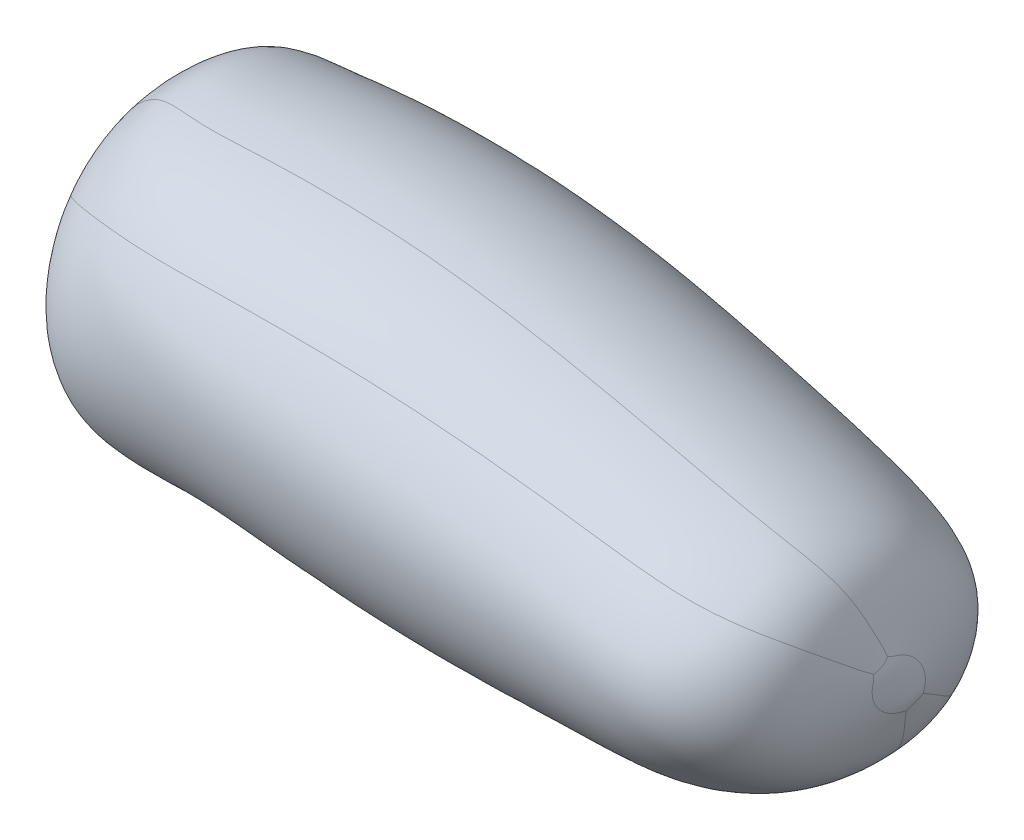
ISO-10303-21;
HEADER;
FILE_DESCRIPTION(('STEP AP214'),'2;1');
FILE_NAME('part.step','',(''),(''),'','','');
FILE_SCHEMA(('AUTOMOTIVE_DESIGN { 1 0 10303 214 1 1 1 1 }'));
ENDSEC;
DATA;
#1=APPLICATION_CONTEXT('core data for automotive mechanical design processes');
#2=APPLICATION_PROTOCOL_DEFINITION('international standard','automotive_design',2000,#1);
#3=PRODUCT_CONTEXT('',#1,'mechanical');
#4=PRODUCT('Part','Part','',(#3));
#5=PRODUCT_RELATED_PRODUCT_CATEGORY('part','',(#4));
#6=PRODUCT_DEFINITION_FORMATION('','',#4);
#7=PRODUCT_DEFINITION_CONTEXT('part definition',#1,'design');
#8=PRODUCT_DEFINITION('design','',#6,#7);
#9=PRODUCT_DEFINITION_SHAPE('','',#8);
#10=(LENGTH_UNIT() NAMED_UNIT(*) SI_UNIT(.MILLI.,.METRE.));
#11=(NAMED_UNIT(*) PLANE_ANGLE_UNIT() SI_UNIT($,.RADIAN.));
#12=(NAMED_UNIT(*) SI_UNIT($,.STERADIAN.) SOLID_ANGLE_UNIT());
#13=UNCERTAINTY_MEASURE_WITH_UNIT(LENGTH_MEASURE(1.E-05),#10,'distance_accuracy_value','');
#14=(GEOMETRIC_REPRESENTATION_CONTEXT(3) GLOBAL_UNCERTAINTY_ASSIGNED_CONTEXT((#13)) GLOBAL_UNIT_ASSIGNED_CONTEXT((#10,
#11,#12)) REPRESENTATION_CONTEXT('',''));
#15=CARTESIAN_POINT('',(0.,0.,0.));
#16=DIRECTION('',(0.,0.,1.));
#17=DIRECTION('',(1.,0.,0.));
#18=AXIS2_PLACEMENT_3D('',#15,#16,#17);
#19=CARTESIAN_POINT('',(727.895790934935,1292.65888960859,-70.9432477584007));
#20=CARTESIAN_POINT('',(727.857525232089,1292.3817548596,-70.8732304235021));
#21=CARTESIAN_POINT('',(727.905741223609,1291.50471669185,-70.6595783417249));
#22=CARTESIAN_POINT('',(727.834004185065,1289.98045953672,-71.1788150169642));
#23=CARTESIAN_POINT('',(727.667987957298,1288.81371187425,-72.3345468414918));
#24=CARTESIAN_POINT('',(727.547715787735,1288.54565294954,-73.2427119621077));
#25=CARTESIAN_POINT('',(727.564858137279,1288.44412809889,-73.5326735927703));
#26=CARTESIAN_POINT('',(727.796349837973,1292.81874561611,-71.2954127522957));
#27=CARTESIAN_POINT('',(727.620377335375,1292.42433212561,-71.5075430763932));
#28=CARTESIAN_POINT('',(727.626562590129,1291.78694473596,-71.606695018846));
#29=CARTESIAN_POINT('',(727.555006263865,1290.48258073661,-72.2163432330707));
#30=CARTESIAN_POINT('',(727.434234791081,1289.3659000228,-73.0510214296392));
#31=CARTESIAN_POINT('',(727.359704535739,1289.00602350146,-73.5740145432364));
#32=CARTESIAN_POINT('',(727.479423686043,1288.62355094953,-73.8433056986715));
#33=CARTESIAN_POINT('',(727.712018241407,1293.16063550165,-71.9460923933082));
#34=CARTESIAN_POINT('',(727.528941566347,1292.79247485655,-72.2277657538675));
#35=CARTESIAN_POINT('',(727.473334138315,1292.39698081756,-72.8451198390166));
#36=CARTESIAN_POINT('',(727.388989533651,1291.16502504722,-73.7287733568525));
#37=CARTESIAN_POINT('',(727.31341113939,1289.8925245156,-74.2378963339463));
#38=CARTESIAN_POINT('',(727.29186990564,1289.31105049952,-74.2633460385086));
#39=CARTESIAN_POINT('',(727.418717790246,1288.89802278056,-74.4652309009601));
#40=CARTESIAN_POINT('',(727.722384490781,1293.35607293605,-72.2879009447821));
#41=CARTESIAN_POINT('',(727.636029277934,1293.26971133072,-72.5996419007878));
#42=CARTESIAN_POINT('',(727.533475061081,1292.97447892925,-73.6342813537652));
#43=CARTESIAN_POINT('',(727.43043574521,1291.61242160487,-74.8125603602637));
#44=CARTESIAN_POINT('',(727.372399920789,1290.07070527965,-75.1784516200874));
#45=CARTESIAN_POINT('',(727.381829240966,1289.2733101656,-74.8920523945349));
#46=CARTESIAN_POINT('',(727.436408052267,1289.01053846427,-74.8170735175011));
#47=(BOUNDED_SURFACE() B_SPLINE_SURFACE(3,3,((#19,#20,#21,#22,#23,#24,#25),(#26,#27,#28,#29,#30,
#31,#32),(#33,#34,#35,#36,#37,#38,#39),(#40,#41,#42,#43,#44,#45,#46)),.UNSPECIFIED.,.F.,.F.,
.F.) B_SPLINE_SURFACE_WITH_KNOTS((4,4),(4,1,1,1,4),(0.,1.),(0.,1.,2.,3.,4.),
.UNSPECIFIED.) GEOMETRIC_REPRESENTATION_ITEM() RATIONAL_B_SPLINE_SURFACE(((0.75,1.,1.,1.,1.,1.,
0.75),(1.,1.,1.,1.,1.,1.,1.),(1.,1.,1.,1.,1.,1.,1.),(0.75,1.,1.,1.,1.,1.,0.75))) REPRESENTATION_ITEM('') SURFACE());
#48=CARTESIAN_POINT('',(727.722384490781,1293.35607293605,-72.2879009447821));
#49=CARTESIAN_POINT('',(727.712018241407,1293.16063550165,-71.9460923933082));
#50=CARTESIAN_POINT('',(727.796349837973,1292.81874561611,-71.2954127522957));
#51=CARTESIAN_POINT('',(727.895790934935,1292.65888960859,-70.9432477584007));
#52=(BOUNDED_CURVE() B_SPLINE_CURVE(3,(#48,#49,#50,#51),.UNSPECIFIED.,.F.,
.F.) B_SPLINE_CURVE_WITH_KNOTS((4,4),(0.,1.),
.UNSPECIFIED.) CURVE() GEOMETRIC_REPRESENTATION_ITEM() RATIONAL_B_SPLINE_CURVE((0.75,1.,1.,0.75)) REPRESENTATION_ITEM(''));
#53=CARTESIAN_POINT('',(727.722384490781,1293.35607293605,-72.2879009447821));
#54=VERTEX_POINT('',#53);
#55=CARTESIAN_POINT('',(727.895790934935,1292.65888960859,-70.9432477584007));
#56=VERTEX_POINT('',#55);
#57=EDGE_CURVE('E76',#54,#56,#52,.T.);
#58=CARTESIAN_POINT('',(727.722384490781,1293.35607293605,-72.2879009447821));
#59=CARTESIAN_POINT('',(727.636029277934,1293.26971133072,-72.5996419007878));
#60=CARTESIAN_POINT('',(727.533475061081,1292.97447892925,-73.6342813537652));
#61=CARTESIAN_POINT('',(727.43043574521,1291.61242160487,-74.8125603602637));
#62=CARTESIAN_POINT('',(727.372399920789,1290.07070527965,-75.1784516200874));
#63=CARTESIAN_POINT('',(727.381829240966,1289.2733101656,-74.8920523945349));
#64=CARTESIAN_POINT('',(727.436408052267,1289.01053846427,-74.8170735175011));
#65=(BOUNDED_CURVE() B_SPLINE_CURVE(3,(#58,#59,#60,#61,#62,#63,#64),.UNSPECIFIED.,.F.,
.F.) B_SPLINE_CURVE_WITH_KNOTS((4,1,1,1,4),(0.,1.,2.,3.,4.),
.UNSPECIFIED.) CURVE() GEOMETRIC_REPRESENTATION_ITEM() RATIONAL_B_SPLINE_CURVE((0.75,1.,1.,1.,
1.,1.,0.75)) REPRESENTATION_ITEM(''));
#66=CARTESIAN_POINT('',(727.436408052267,1289.01053846427,-74.817073517501));
#67=VERTEX_POINT('',#66);
#68=EDGE_CURVE('E79',#67,#54,#65,.F.);
#69=CARTESIAN_POINT('',(727.564858137279,1288.44412809889,-73.5326735927703));
#70=CARTESIAN_POINT('',(727.479423686043,1288.62355094953,-73.8433056986715));
#71=CARTESIAN_POINT('',(727.418717790246,1288.89802278056,-74.4652309009601));
#72=CARTESIAN_POINT('',(727.436408052267,1289.01053846427,-74.8170735175011));
#73=(BOUNDED_CURVE() B_SPLINE_CURVE(3,(#69,#70,#71,#72),.UNSPECIFIED.,.F.,
.F.) B_SPLINE_CURVE_WITH_KNOTS((4,4),(0.,1.),
.UNSPECIFIED.) CURVE() GEOMETRIC_REPRESENTATION_ITEM() RATIONAL_B_SPLINE_CURVE((0.75,1.,1.,0.75)) REPRESENTATION_ITEM(''));
#74=CARTESIAN_POINT('',(727.564858137278,1288.44412809889,-73.5326735927703));
#75=VERTEX_POINT('',#74);
#76=EDGE_CURVE('E107',#67,#75,#73,.F.);
#77=CARTESIAN_POINT('',(727.564858137279,1288.44412809889,-73.5326735927703));
#78=CARTESIAN_POINT('',(727.547715787735,1288.54565294954,-73.2427119621077));
#79=CARTESIAN_POINT('',(727.667987957298,1288.81371187425,-72.3345468414918));
#80=CARTESIAN_POINT('',(727.834004185065,1289.98045953672,-71.1788150169642));
#81=CARTESIAN_POINT('',(727.905741223609,1291.50471669185,-70.6595783417249));
#82=CARTESIAN_POINT('',(727.857525232089,1292.3817548596,-70.8732304235021));
#83=CARTESIAN_POINT('',(727.895790934935,1292.65888960859,-70.9432477584007));
#84=(BOUNDED_CURVE() B_SPLINE_CURVE(3,(#77,#78,#79,#80,#81,#82,#83),.UNSPECIFIED.,.F.,
.F.) B_SPLINE_CURVE_WITH_KNOTS((4,1,1,1,4),(0.,1.,2.,3.,4.),
.UNSPECIFIED.) CURVE() GEOMETRIC_REPRESENTATION_ITEM() RATIONAL_B_SPLINE_CURVE((0.75,1.,1.,1.,
1.,1.,0.75)) REPRESENTATION_ITEM(''));
#85=EDGE_CURVE('E82',#56,#75,#84,.F.);
#86=ORIENTED_EDGE('',*,*,#57,.F.);
#87=ORIENTED_EDGE('',*,*,#68,.F.);
#88=ORIENTED_EDGE('',*,*,#76,.T.);
#89=ORIENTED_EDGE('',*,*,#85,.F.);
#90=EDGE_LOOP('',(#86,#87,#88,#89));
#91=FACE_BOUND('',#90,.T.);
#92=ADVANCED_FACE('F33',(#91),#47,.T.);
#93=CARTESIAN_POINT('',(755.014879637663,1287.97846725011,-75.1172581475418));
#94=CARTESIAN_POINT('',(755.057385606633,1287.95703309226,-74.9120606616865));
#95=CARTESIAN_POINT('',(755.063471681654,1287.85817061027,-74.6337769279165));
#96=CARTESIAN_POINT('',(755.033113317336,1287.7588492855,-74.4767499142738));
#97=CARTESIAN_POINT('',(755.061221092996,1288.13123648074,-75.1078935626558));
#98=CARTESIAN_POINT('',(755.192574486305,1288.24113739568,-74.688134006092));
#99=CARTESIAN_POINT('',(755.200897884253,1288.14346406595,-74.4087307578159));
#100=CARTESIAN_POINT('',(755.086647236468,1287.85183535096,-74.2857133224239));
#101=CARTESIAN_POINT('',(755.086103314203,1288.50056778811,-75.1851432902321));
#102=CARTESIAN_POINT('',(755.219299479098,1288.48308972501,-74.61363029583));
#103=CARTESIAN_POINT('',(755.24010128673,1288.31729268108,-74.1161728674537));
#104=CARTESIAN_POINT('',(755.14875129527,1288.02613077418,-73.720471385505));
#105=CARTESIAN_POINT('',(755.126737726381,1289.18506341885,-74.9311463681352));
#106=CARTESIAN_POINT('',(755.264762914278,1289.00143163266,-74.3349108032536));
#107=CARTESIAN_POINT('',(755.309451572832,1288.82396205785,-73.6967130291101));
#108=CARTESIAN_POINT('',(755.25896790665,1288.67689385671,-73.0509195561584));
#109=CARTESIAN_POINT('',(755.1652717274,1289.78648851624,-74.2983409529255));
#110=CARTESIAN_POINT('',(755.290350392555,1289.46841397328,-73.9563991579886));
#111=CARTESIAN_POINT('',(755.3293850499,1289.30327487166,-73.4827947692707));
#112=CARTESIAN_POINT('',(755.279549766059,1289.30984237754,-72.9033761664824));
#113=CARTESIAN_POINT('',(755.195576323844,1289.90754229801,-73.8102659265982));
#114=CARTESIAN_POINT('',(755.3062672046,1289.59843618107,-73.7184494558356));
#115=CARTESIAN_POINT('',(755.33391439379,1289.49479854137,-73.4573663666932));
#116=CARTESIAN_POINT('',(755.276735848495,1289.60859272306,-73.0416332430992));
#117=CARTESIAN_POINT('',(755.17804443598,1289.99066793212,-73.6338257112497));
#118=CARTESIAN_POINT('',(755.224623932417,1289.87767769071,-73.4996973681886));
#119=CARTESIAN_POINT('',(755.256322040381,1289.76797292463,-73.2431373528388));
#120=CARTESIAN_POINT('',(755.24406712799,1289.75277758467,-73.0373916083979));
#121=(BOUNDED_SURFACE() B_SPLINE_SURFACE(3,3,((#93,#94,#95,#96),(#97,#98,#99,#100),(#101,#102,
#103,#104),(#105,#106,#107,#108),(#109,#110,#111,#112),(#113,#114,#115,#116),(#117,#118,#119,
#120)),.UNSPECIFIED.,.F.,.F.,.F.) B_SPLINE_SURFACE_WITH_KNOTS((4,1,1,1,4),(4,4),(0.,1.,2.,3.,
4.),(0.,1.),.UNSPECIFIED.) GEOMETRIC_REPRESENTATION_ITEM() RATIONAL_B_SPLINE_SURFACE(((0.75,1.,
1.,0.75),(1.,1.,1.,1.),(1.,1.,1.,1.),(1.,1.,1.,1.),(1.,1.,1.,1.),(1.,1.,1.,1.),(0.75,1.,1.,0.75))) REPRESENTATION_ITEM('') SURFACE());
#122=CARTESIAN_POINT('',(755.17804443598,1289.99066793212,-73.6338257112497));
#123=CARTESIAN_POINT('',(755.195576323844,1289.90754229801,-73.8102659265982));
#124=CARTESIAN_POINT('',(755.1652717274,1289.78648851624,-74.2983409529255));
#125=CARTESIAN_POINT('',(755.126737726381,1289.18506341885,-74.9311463681352));
#126=CARTESIAN_POINT('',(755.086103314203,1288.50056778811,-75.1851432902321));
#127=CARTESIAN_POINT('',(755.061221092996,1288.13123648074,-75.1078935626558));
#128=CARTESIAN_POINT('',(755.014879637663,1287.97846725011,-75.1172581475418));
#129=(BOUNDED_CURVE() B_SPLINE_CURVE(3,(#122,#123,#124,#125,#126,#127,#128),.UNSPECIFIED.,.F.,
.F.) B_SPLINE_CURVE_WITH_KNOTS((4,1,1,1,4),(0.,1.,2.,3.,4.),
.UNSPECIFIED.) CURVE() GEOMETRIC_REPRESENTATION_ITEM() RATIONAL_B_SPLINE_CURVE((0.75,1.,1.,1.,
1.,1.,0.75)) REPRESENTATION_ITEM(''));
#130=CARTESIAN_POINT('',(755.17804443598,1289.99066793212,-73.6338257112496));
#131=VERTEX_POINT('',#130);
#132=CARTESIAN_POINT('',(755.014879637663,1287.97846725011,-75.1172581475417));
#133=VERTEX_POINT('',#132);
#134=EDGE_CURVE('E93',#131,#133,#129,.T.);
#135=CARTESIAN_POINT('',(755.17804443598,1289.99066793212,-73.6338257112497));
#136=CARTESIAN_POINT('',(755.224623932417,1289.87767769071,-73.4996973681886));
#137=CARTESIAN_POINT('',(755.256322040381,1289.76797292463,-73.2431373528388));
#138=CARTESIAN_POINT('',(755.24406712799,1289.75277758467,-73.0373916083979));
#139=(BOUNDED_CURVE() B_SPLINE_CURVE(3,(#135,#136,#137,#138),.UNSPECIFIED.,.F.,
.F.) B_SPLINE_CURVE_WITH_KNOTS((4,4),(0.,1.),
.UNSPECIFIED.) CURVE() GEOMETRIC_REPRESENTATION_ITEM() RATIONAL_B_SPLINE_CURVE((0.75,1.,1.,0.75)) REPRESENTATION_ITEM(''));
#140=CARTESIAN_POINT('',(755.24406712799,1289.75277758467,-73.0373916083979));
#141=VERTEX_POINT('',#140);
#142=EDGE_CURVE('E86',#141,#131,#139,.F.);
#143=CARTESIAN_POINT('',(755.033113317336,1287.7588492855,-74.4767499142847));
#144=CARTESIAN_POINT('',(755.086647236468,1287.85183535096,-74.2857133224239));
#145=CARTESIAN_POINT('',(755.14875129527,1288.02613077418,-73.720471385505));
#146=CARTESIAN_POINT('',(755.25896790665,1288.67689385671,-73.0509195561584));
#147=CARTESIAN_POINT('',(755.279549766059,1289.30984237754,-72.9033761664824));
#148=CARTESIAN_POINT('',(755.276735848495,1289.60859272306,-73.0416332430992));
#149=CARTESIAN_POINT('',(755.24406712799,1289.75277758467,-73.0373916083979));
#150=(BOUNDED_CURVE() B_SPLINE_CURVE(3,(#143,#144,#145,#146,#147,#148,#149),.UNSPECIFIED.,.F.,
.F.) B_SPLINE_CURVE_WITH_KNOTS((4,1,1,1,4),(0.,1.,2.,3.,4.),
.UNSPECIFIED.) CURVE() GEOMETRIC_REPRESENTATION_ITEM() RATIONAL_B_SPLINE_CURVE((0.75,1.,1.,1.,
1.,1.,0.75)) REPRESENTATION_ITEM(''));
#151=CARTESIAN_POINT('',(755.033113317337,1287.7588492855,-74.4767499142792));
#152=VERTEX_POINT('',#151);
#153=EDGE_CURVE('E96',#152,#141,#150,.T.);
#154=CARTESIAN_POINT('',(755.014879637663,1287.97846725011,-75.1172581475418));
#155=CARTESIAN_POINT('',(755.057385606633,1287.95703309226,-74.9120606616865));
#156=CARTESIAN_POINT('',(755.063471681654,1287.85817061027,-74.6337769279165));
#157=CARTESIAN_POINT('',(755.033113317336,1287.7588492855,-74.4767499142738));
#158=(BOUNDED_CURVE() B_SPLINE_CURVE(3,(#154,#155,#156,#157),.UNSPECIFIED.,.F.,
.F.) B_SPLINE_CURVE_WITH_KNOTS((4,4),(0.,1.),
.UNSPECIFIED.) CURVE() GEOMETRIC_REPRESENTATION_ITEM() RATIONAL_B_SPLINE_CURVE((0.75,1.,1.,0.75)) REPRESENTATION_ITEM(''));
#159=EDGE_CURVE('E51',#152,#133,#158,.F.);
#160=ORIENTED_EDGE('',*,*,#134,.F.);
#161=ORIENTED_EDGE('',*,*,#142,.F.);
#162=ORIENTED_EDGE('',*,*,#153,.F.);
#163=ORIENTED_EDGE('',*,*,#159,.T.);
#164=EDGE_LOOP('',(#160,#161,#162,#163));
#165=FACE_BOUND('',#164,.T.);
#166=ADVANCED_FACE('F163',(#165),#121,.T.);
#167=CARTESIAN_POINT('',(727.722384490781,1293.35607293605,-72.2879009447821));
#168=CARTESIAN_POINT('',(727.819105952993,1293.6378719758,-72.3179685402395));
#169=CARTESIAN_POINT('',(728.29060540619,1294.79023324692,-72.0838739669916));
#170=CARTESIAN_POINT('',(729.993296988329,1296.54078400576,-71.7383920107062));
#171=CARTESIAN_POINT('',(732.026305571197,1296.78295500037,-71.1234466049867));
#172=CARTESIAN_POINT('',(734.695115540397,1296.84891099342,-71.2897793570213));
#173=CARTESIAN_POINT('',(738.934247166936,1296.60221152276,-71.5395803267653));
#174=CARTESIAN_POINT('',(743.012795354635,1295.85666090412,-71.7878133899107));
#175=CARTESIAN_POINT('',(747.21177255464,1294.83780030156,-71.9242016263204));
#176=CARTESIAN_POINT('',(752.17013923959,1293.74355080977,-71.8492827138286));
#177=CARTESIAN_POINT('',(754.285606124634,1292.58511331909,-72.5955328388249));
#178=CARTESIAN_POINT('',(754.886957456174,1291.17897930569,-73.2033908836443));
#179=CARTESIAN_POINT('',(755.113933051661,1290.18678380765,-73.5915138389622));
#180=CARTESIAN_POINT('',(755.17804443598,1289.99066793212,-73.6338257112497));
#181=CARTESIAN_POINT('',(727.712018241407,1293.16063550165,-71.9460923933082));
#182=CARTESIAN_POINT('',(727.895094916466,1293.52879614673,-71.6644190327599));
#183=CARTESIAN_POINT('',(728.39933281356,1294.6334014711,-71.1521251646071));
#184=CARTESIAN_POINT('',(730.169313931008,1296.31890030928,-70.3640531892583));
#185=CARTESIAN_POINT('',(732.488999467601,1296.60573805659,-69.647892114114));
#186=CARTESIAN_POINT('',(735.131727651868,1296.63229656287,-69.7968379930842));
#187=CARTESIAN_POINT('',(739.298675128604,1296.36203237613,-70.0928808621076));
#188=CARTESIAN_POINT('',(743.294627050993,1295.63545047647,-70.4195935184136));
#189=CARTESIAN_POINT('',(747.435959044094,1294.67108362673,-70.6394275489642));
#190=CARTESIAN_POINT('',(752.277611675089,1293.64744002569,-70.634287150214));
#191=CARTESIAN_POINT('',(754.369491313951,1292.50542233121,-71.6922307860341));
#192=CARTESIAN_POINT('',(754.938494686694,1291.12801201958,-72.6517431486564));
#193=CARTESIAN_POINT('',(755.142980660243,1290.15691920035,-73.2809452805526));
#194=CARTESIAN_POINT('',(755.224623932417,1289.87767769071,-73.4996973681886));
#195=CARTESIAN_POINT('',(727.796349837973,1292.81874561611,-71.2954127522957));
#196=CARTESIAN_POINT('',(727.97232234058,1293.2131591066,-71.0832824281981));
#197=CARTESIAN_POINT('',(728.509936230597,1294.18088246195,-70.330958563163));
#198=CARTESIAN_POINT('',(730.351561663795,1295.66317439806,-69.1816431772497));
#199=CARTESIAN_POINT('',(732.983935029162,1295.96515955282,-68.5221243251012));
#200=CARTESIAN_POINT('',(735.660474185949,1295.96896632181,-68.6559663998527));
#201=CARTESIAN_POINT('',(739.748443962276,1295.67427114894,-68.9895658059721));
#202=CARTESIAN_POINT('',(743.65918885503,1294.99642965706,-69.3650686324973));
#203=CARTESIAN_POINT('',(747.711728581405,1294.14174095156,-69.6279427225224));
#204=CARTESIAN_POINT('',(752.410513334655,1293.23009516097,-69.6642017174658));
#205=CARTESIAN_POINT('',(754.472543282349,1292.18243982601,-70.9636154229836));
#206=CARTESIAN_POINT('',(755.001834856668,1290.92647015964,-72.2052772026937));
#207=CARTESIAN_POINT('',(755.178729686972,1290.04114730788,-73.0289083389953));
#208=CARTESIAN_POINT('',(755.256322040381,1289.76797292463,-73.2431373528388));
#209=CARTESIAN_POINT('',(727.895790934935,1292.65888960859,-70.9432477584007));
#210=CARTESIAN_POINT('',(728.033497734696,1292.77616835008,-70.6611000994154));
#211=CARTESIAN_POINT('',(728.598934016556,1293.55674661816,-69.7350582830411));
#212=CARTESIAN_POINT('',(730.507804624179,1294.75453329146,-68.3255950180596));
#213=CARTESIAN_POINT('',(733.443946281191,1295.05623219941,-67.7358597236189));
#214=CARTESIAN_POINT('',(736.136471714012,1295.03803680381,-67.8408542287366));
#215=CARTESIAN_POINT('',(740.153747189143,1294.75336643769,-68.1699056348457));
#216=CARTESIAN_POINT('',(743.974820961558,1294.157059869,-68.560497019083));
#217=CARTESIAN_POINT('',(747.942509604675,1293.42829616288,-68.8413118692658));
#218=CARTESIAN_POINT('',(752.482503175278,1292.65078734678,-68.894558234375));
#219=CARTESIAN_POINT('',(754.530296575929,1291.73396809842,-70.383731170684));
#220=CARTESIAN_POINT('',(755.037693763776,1290.64772902948,-71.849133761334));
#221=CARTESIAN_POINT('',(755.199143495096,1289.8817671063,-72.8274042292556));
#222=CARTESIAN_POINT('',(755.24406712799,1289.75277758467,-73.0373916083979));
#223=(BOUNDED_SURFACE() B_SPLINE_SURFACE(3,3,((#167,#168,#169,#170,#171,#172,#173,#174,#175,
#176,#177,#178,#179,#180),(#181,#182,#183,#184,#185,#186,#187,#188,#189,#190,#191,#192,#193,
#194),(#195,#196,#197,#198,#199,#200,#201,#202,#203,#204,#205,#206,#207,#208),(#209,#210,#211,
#212,#213,#214,#215,#216,#217,#218,#219,#220,#221,#222)),.UNSPECIFIED.,.F.,.F.,
.F.) B_SPLINE_SURFACE_WITH_KNOTS((4,4),(4,1,1,1,1,1,1,1,1,1,1,4),(0.,1.),(0.,1.,2.,3.,4.,5.,6.,
7.,8.,9.,10.,11.),
.UNSPECIFIED.) GEOMETRIC_REPRESENTATION_ITEM() RATIONAL_B_SPLINE_SURFACE(((0.75,1.,1.,1.,1.,1.,
1.,1.,1.,1.,1.,1.,1.,0.75),(1.,1.,1.,1.,1.,1.,1.,1.,1.,1.,1.,1.,1.,1.),(1.,1.,1.,1.,1.,1.,1.,1.,
1.,1.,1.,1.,1.,1.),(0.75,1.,1.,1.,1.,1.,1.,1.,1.,1.,1.,1.,1.,0.75))) REPRESENTATION_ITEM('') SURFACE());
#224=CARTESIAN_POINT('',(727.895790934935,1292.65888960859,-70.9432477584007));
#225=CARTESIAN_POINT('',(728.033497734696,1292.77616835008,-70.6611000994154));
#226=CARTESIAN_POINT('',(728.598934016556,1293.55674661816,-69.7350582830411));
#227=CARTESIAN_POINT('',(730.507804624179,1294.75453329146,-68.3255950180596));
#228=CARTESIAN_POINT('',(733.443946281191,1295.05623219941,-67.7358597236189));
#229=CARTESIAN_POINT('',(736.136471714012,1295.03803680381,-67.8408542287366));
#230=CARTESIAN_POINT('',(740.153747189143,1294.75336643769,-68.1699056348457));
#231=CARTESIAN_POINT('',(743.974820961558,1294.157059869,-68.560497019083));
#232=CARTESIAN_POINT('',(747.942509604675,1293.42829616288,-68.8413118692658));
#233=CARTESIAN_POINT('',(752.482503175278,1292.65078734678,-68.894558234375));
#234=CARTESIAN_POINT('',(754.530296575929,1291.73396809842,-70.383731170684));
#235=CARTESIAN_POINT('',(755.037693763776,1290.64772902948,-71.849133761334));
#236=CARTESIAN_POINT('',(755.199143495096,1289.8817671063,-72.8274042292556));
#237=CARTESIAN_POINT('',(755.24406712799,1289.75277758467,-73.0373916083979));
#238=(BOUNDED_CURVE() B_SPLINE_CURVE(3,(#224,#225,#226,#227,#228,#229,#230,#231,#232,#233,#234,
#235,#236,#237),.UNSPECIFIED.,.F.,.F.) B_SPLINE_CURVE_WITH_KNOTS((4,1,1,1,1,1,1,1,1,1,1,4),(0.,
1.,2.,3.,4.,5.,6.,7.,8.,9.,10.,11.),
.UNSPECIFIED.) CURVE() GEOMETRIC_REPRESENTATION_ITEM() RATIONAL_B_SPLINE_CURVE((0.75,1.,1.,1.,
1.,1.,1.,1.,1.,1.,1.,1.,1.,0.75)) REPRESENTATION_ITEM(''));
#239=EDGE_CURVE('E100',#141,#56,#238,.F.);
#240=CARTESIAN_POINT('',(727.722384490781,1293.35607293605,-72.2879009447821));
#241=CARTESIAN_POINT('',(727.819105952993,1293.6378719758,-72.3179685402395));
#242=CARTESIAN_POINT('',(728.29060540619,1294.79023324692,-72.0838739669916));
#243=CARTESIAN_POINT('',(729.993296988329,1296.54078400576,-71.7383920107062));
#244=CARTESIAN_POINT('',(732.026305571197,1296.78295500037,-71.1234466049867));
#245=CARTESIAN_POINT('',(734.695115540397,1296.84891099342,-71.2897793570213));
#246=CARTESIAN_POINT('',(738.934247166936,1296.60221152276,-71.5395803267653));
#247=CARTESIAN_POINT('',(743.012795354635,1295.85666090412,-71.7878133899107));
#248=CARTESIAN_POINT('',(747.21177255464,1294.83780030156,-71.9242016263204));
#249=CARTESIAN_POINT('',(752.17013923959,1293.74355080977,-71.8492827138286));
#250=CARTESIAN_POINT('',(754.285606124634,1292.58511331909,-72.5955328388249));
#251=CARTESIAN_POINT('',(754.886957456174,1291.17897930569,-73.2033908836443));
#252=CARTESIAN_POINT('',(755.113933051661,1290.18678380765,-73.5915138389622));
#253=CARTESIAN_POINT('',(755.17804443598,1289.99066793212,-73.6338257112497));
#254=(BOUNDED_CURVE() B_SPLINE_CURVE(3,(#240,#241,#242,#243,#244,#245,#246,#247,#248,#249,#250,
#251,#252,#253),.UNSPECIFIED.,.F.,.F.) B_SPLINE_CURVE_WITH_KNOTS((4,1,1,1,1,1,1,1,1,1,1,4),(0.,
1.,2.,3.,4.,5.,6.,7.,8.,9.,10.,11.),
.UNSPECIFIED.) CURVE() GEOMETRIC_REPRESENTATION_ITEM() RATIONAL_B_SPLINE_CURVE((0.75,1.,1.,1.,
1.,1.,1.,1.,1.,1.,1.,1.,1.,0.75)) REPRESENTATION_ITEM(''));
#255=EDGE_CURVE('E90',#54,#131,#254,.T.);
#256=ORIENTED_EDGE('',*,*,#57,.T.);
#257=ORIENTED_EDGE('',*,*,#239,.F.);
#258=ORIENTED_EDGE('',*,*,#142,.T.);
#259=ORIENTED_EDGE('',*,*,#255,.F.);
#260=EDGE_LOOP('',(#256,#257,#258,#259));
#261=FACE_BOUND('',#260,.T.);
#262=ADVANCED_FACE('F91',(#261),#223,.T.);
#263=CARTESIAN_POINT('',(727.564858137279,1288.44412809889,-73.5326735927703));
#264=CARTESIAN_POINT('',(727.547715787735,1288.54565294954,-73.2427119621077));
#265=CARTESIAN_POINT('',(727.667987957298,1288.81371187425,-72.3345468414918));
#266=CARTESIAN_POINT('',(727.834004185065,1289.98045953672,-71.1788150169642));
#267=CARTESIAN_POINT('',(727.905741223609,1291.50471669185,-70.6595783417249));
#268=CARTESIAN_POINT('',(727.857525232089,1292.3817548596,-70.8732304235021));
#269=CARTESIAN_POINT('',(727.895790934935,1292.65888960859,-70.9432477584007));
#270=CARTESIAN_POINT('',(727.66743493803,1288.1631803976,-73.5120031175427));
#271=CARTESIAN_POINT('',(727.735727039732,1288.08528239761,-72.9114093809788));
#272=CARTESIAN_POINT('',(727.901741123515,1288.26152372572,-71.6180722533445));
#273=CARTESIAN_POINT('',(728.113002106273,1289.47833833685,-70.1412868008687));
#274=CARTESIAN_POINT('',(728.184919857079,1291.22248864773,-69.7124616646038));
#275=CARTESIAN_POINT('',(728.094673128822,1292.33917759357,-70.2389177706218));
#276=CARTESIAN_POINT('',(728.033497734696,1292.77616835008,-70.6611000994154));
#277=CARTESIAN_POINT('',(728.079864865081,1286.98991623163,-73.8128606935255));
#278=CARTESIAN_POINT('',(728.179641412399,1286.88131096903,-72.9619075358993));
#279=CARTESIAN_POINT('',(728.422645109869,1287.13347690017,-71.1229691982282));
#280=CARTESIAN_POINT('',(728.724498955541,1288.86219894162,-69.0130796729523));
#281=CARTESIAN_POINT('',(728.822716112211,1291.34110541752,-68.3978900853303));
#282=CARTESIAN_POINT('',(728.687931802496,1292.93261077436,-69.1391580029191));
#283=CARTESIAN_POINT('',(728.598934016556,1293.55674661816,-69.7350582830411));
#284=CARTESIAN_POINT('',(729.781207202941,1285.09952862288,-74.5303472555222));
#285=CARTESIAN_POINT('',(729.949515918826,1284.96367995094,-73.2859263910054));
#286=CARTESIAN_POINT('',(730.351118833633,1285.36675483127,-70.5625702514012));
#287=CARTESIAN_POINT('',(730.812732802904,1287.9092140345,-67.3812225511949));
#288=CARTESIAN_POINT('',(730.924523960571,1291.52277958092,-66.4101742461807));
#289=CARTESIAN_POINT('',(730.664047584572,1293.84589218486,-67.4695468588804));
#290=CARTESIAN_POINT('',(730.507804624179,1294.75453329146,-68.3255950180596));
#291=CARTESIAN_POINT('',(732.958816514396,1284.69756513903,-75.7079579702306));
#292=CARTESIAN_POINT('',(733.318062652679,1284.65866542123,-74.3737374598963));
#293=CARTESIAN_POINT('',(734.12707169039,1285.27040901521,-71.2602123997821));
#294=CARTESIAN_POINT('',(734.887392164398,1288.09435907102,-67.4130808932671));
#295=CARTESIAN_POINT('',(734.75413141821,1291.79275243993,-66.0560722941897));
#296=CARTESIAN_POINT('',(733.903957533219,1294.14730484601,-66.9495951221149));
#297=CARTESIAN_POINT('',(733.443946281191,1295.05623219941,-67.7358597236189));
#298=CARTESIAN_POINT('',(735.311238654303,1284.64994590667,-75.8877556113161));
#299=CARTESIAN_POINT('',(735.665277256312,1284.55697360639,-74.5167046739084));
#300=CARTESIAN_POINT('',(736.527394182121,1285.06566276404,-71.267890029538));
#301=CARTESIAN_POINT('',(737.443916222057,1287.94358304395,-67.23656641098));
#302=CARTESIAN_POINT('',(737.458966286055,1291.71004969582,-66.0470365595975));
#303=CARTESIAN_POINT('',(736.612469242048,1294.10710728578,-67.0257420576206));
#304=CARTESIAN_POINT('',(736.136471714012,1295.03803680381,-67.8408542287366));
#305=CARTESIAN_POINT('',(739.146129731992,1284.26015184513,-76.0765142286497));
#306=CARTESIAN_POINT('',(739.445405752949,1284.12601253724,-74.6323814765221));
#307=CARTESIAN_POINT('',(740.294050296772,1284.62443379203,-71.1624084180561));
#308=CARTESIAN_POINT('',(741.195142557787,1287.76556322574,-67.080195610333));
#309=CARTESIAN_POINT('',(741.280725656122,1291.52436533592,-66.2782348915398));
#310=CARTESIAN_POINT('',(740.559050416011,1293.83246172646,-67.3502454637521));
#311=CARTESIAN_POINT('',(740.153747189143,1294.75336643769,-68.1699056348457));
#312=CARTESIAN_POINT('',(743.117112050674,1283.94645262845,-76.1104106348512));
#313=CARTESIAN_POINT('',(743.368902297144,1283.81012848965,-74.6554676102598));
#314=CARTESIAN_POINT('',(744.121819598652,1284.34835418639,-71.1174445218618));
#315=CARTESIAN_POINT('',(744.866929623312,1287.67192271042,-67.1971419892229));
#316=CARTESIAN_POINT('',(744.823857886115,1291.23825256758,-66.6466887239203));
#317=CARTESIAN_POINT('',(744.290453068086,1293.31769008096,-67.7559254056795));
#318=CARTESIAN_POINT('',(743.974820961558,1294.157059869,-68.560497019083));
#319=CARTESIAN_POINT('',(747.151267417743,1283.91486202406,-76.0259531038242));
#320=CARTESIAN_POINT('',(747.371309761116,1283.84018150272,-74.615389005079));
#321=CARTESIAN_POINT('',(748.023154729311,1284.48607220388,-71.1711355771517));
#322=CARTESIAN_POINT('',(748.633790922338,1287.70143217654,-67.3733268851611));
#323=CARTESIAN_POINT('',(748.544875646456,1290.91975756977,-66.9311272558335));
#324=CARTESIAN_POINT('',(748.173290627953,1292.71485137419,-68.0546810159873));
#325=CARTESIAN_POINT('',(747.942509604675,1293.42829616288,-68.8413118692658));
#326=CARTESIAN_POINT('',(751.532325898765,1284.04465555181,-75.7182119546103));
#327=CARTESIAN_POINT('',(751.635236345011,1284.05671581248,-74.3509135537275));
#328=CARTESIAN_POINT('',(751.989701521231,1284.77837704143,-70.9996002178665));
#329=CARTESIAN_POINT('',(752.546805451943,1287.75061725797,-67.3119191518724));
#330=CARTESIAN_POINT('',(752.576649059235,1290.58893800523,-66.9865116844063));
#331=CARTESIAN_POINT('',(752.5544930159,1292.07147953259,-68.1249147512732));
#332=CARTESIAN_POINT('',(752.482503175278,1292.65078734678,-68.894558234375));
#333=CARTESIAN_POINT('',(753.809079629982,1285.15843298365,-75.342139185056));
#334=CARTESIAN_POINT('',(753.878495236326,1285.15084598843,-74.3286739135491));
#335=CARTESIAN_POINT('',(754.129136156495,1285.66857946568,-71.8749035036472));
#336=CARTESIAN_POINT('',(754.561907606817,1287.92336744649,-69.1800348416238));
#337=CARTESIAN_POINT('',(754.612959107002,1290.13757447084,-68.9415406353088));
#338=CARTESIAN_POINT('',(754.588049869509,1291.28549637082,-69.8038469183844));
#339=CARTESIAN_POINT('',(754.530296575929,1291.73396809842,-70.383731170684));
#340=CARTESIAN_POINT('',(754.595149563597,1286.58143417974,-74.8557977815263));
#341=CARTESIAN_POINT('',(754.636751128874,1286.57318742399,-74.2372891584893));
#342=CARTESIAN_POINT('',(754.788401649904,1286.88606431604,-72.7447353490961));
#343=CARTESIAN_POINT('',(755.05517618585,1288.28064098903,-71.1062042562255));
#344=CARTESIAN_POINT('',(755.090307959318,1289.65710709861,-70.9613484465264));
#345=CARTESIAN_POINT('',(755.073552670873,1290.36898789933,-71.4929903199962));
#346=CARTESIAN_POINT('',(755.037693763776,1290.64772902948,-71.849133761334));
#347=CARTESIAN_POINT('',(754.949221033869,1287.56654189528,-74.5107594925137));
#348=CARTESIAN_POINT('',(754.972396588684,1287.56020663598,-74.162695887021));
#349=CARTESIAN_POINT('',(755.057401303811,1287.73496886729,-73.3247699035782));
#350=CARTESIAN_POINT('',(755.208484240458,1288.52982565555,-72.4051260832068));
#351=CARTESIAN_POINT('',(755.229714482199,1289.31640988341,-72.3239575636942));
#352=CARTESIAN_POINT('',(755.21955730321,1289.72238690474,-72.625900119527));
#353=CARTESIAN_POINT('',(755.199143495096,1289.8817671063,-72.8274042292556));
#354=CARTESIAN_POINT('',(755.033113317336,1287.7588492855,-74.4767499142847));
#355=CARTESIAN_POINT('',(755.086647236468,1287.85183535096,-74.2857133224239));
#356=CARTESIAN_POINT('',(755.14875129527,1288.02613077418,-73.720471385505));
#357=CARTESIAN_POINT('',(755.25896790665,1288.67689385671,-73.0509195561584));
#358=CARTESIAN_POINT('',(755.279549766059,1289.30984237754,-72.9033761664824));
#359=CARTESIAN_POINT('',(755.276735848495,1289.60859272306,-73.0416332430992));
#360=CARTESIAN_POINT('',(755.24406712799,1289.75277758467,-73.0373916083979));
#361=(BOUNDED_SURFACE() B_SPLINE_SURFACE(3,3,((#263,#264,#265,#266,#267,#268,#269),(#270,#271,
#272,#273,#274,#275,#276),(#277,#278,#279,#280,#281,#282,#283),(#284,#285,#286,#287,#288,#289,
#290),(#291,#292,#293,#294,#295,#296,#297),(#298,#299,#300,#301,#302,#303,#304),(#305,#306,#307,
#308,#309,#310,#311),(#312,#313,#314,#315,#316,#317,#318),(#319,#320,#321,#322,#323,#324,#325),
(#326,#327,#328,#329,#330,#331,#332),(#333,#334,#335,#336,#337,#338,#339),(#340,#341,#342,#343,
#344,#345,#346),(#347,#348,#349,#350,#351,#352,#353),(#354,#355,#356,#357,#358,#359,#360)),
.UNSPECIFIED.,.F.,.F.,.F.) B_SPLINE_SURFACE_WITH_KNOTS((4,1,1,1,1,1,1,1,1,1,1,4),(4,1,1,1,4),
(0.,1.,2.,3.,4.,5.,6.,7.,8.,9.,10.,11.),(0.,1.,2.,3.,4.),
.UNSPECIFIED.) GEOMETRIC_REPRESENTATION_ITEM() RATIONAL_B_SPLINE_SURFACE(((0.75,1.,1.,1.,1.,1.,
0.75),(1.,1.,1.,1.,1.,1.,1.),(1.,1.,1.,1.,1.,1.,1.),(1.,1.,1.,1.,1.,1.,1.),(1.,1.,1.,1.,1.,1.,
1.),(1.,1.,1.,1.,1.,1.,1.),(1.,1.,1.,1.,1.,1.,1.),(1.,1.,1.,1.,1.,1.,1.),(1.,1.,1.,1.,1.,1.,1.),
(1.,1.,1.,1.,1.,1.,1.),(1.,1.,1.,1.,1.,1.,1.),(1.,1.,1.,1.,1.,1.,1.),(1.,1.,1.,1.,1.,1.,1.),
(0.75,1.,1.,1.,1.,1.,0.75))) REPRESENTATION_ITEM('') SURFACE());
#362=CARTESIAN_POINT('',(727.564858137279,1288.44412809889,-73.5326735927703));
#363=CARTESIAN_POINT('',(727.66743493803,1288.1631803976,-73.5120031175427));
#364=CARTESIAN_POINT('',(728.079864865081,1286.98991623163,-73.8128606935255));
#365=CARTESIAN_POINT('',(729.781207202941,1285.09952862288,-74.5303472555222));
#366=CARTESIAN_POINT('',(732.958816514396,1284.69756513903,-75.7079579702306));
#367=CARTESIAN_POINT('',(735.311238654303,1284.64994590667,-75.8877556113161));
#368=CARTESIAN_POINT('',(739.146129731992,1284.26015184513,-76.0765142286497));
#369=CARTESIAN_POINT('',(743.117112050674,1283.94645262845,-76.1104106348512));
#370=CARTESIAN_POINT('',(747.151267417743,1283.91486202406,-76.0259531038242));
#371=CARTESIAN_POINT('',(751.532325898765,1284.04465555181,-75.7182119546103));
#372=CARTESIAN_POINT('',(753.809079629982,1285.15843298365,-75.342139185056));
#373=CARTESIAN_POINT('',(754.595149563597,1286.58143417974,-74.8557977815263));
#374=CARTESIAN_POINT('',(754.949221033869,1287.56654189528,-74.5107594925137));
#375=CARTESIAN_POINT('',(755.033113317336,1287.7588492855,-74.4767499142847));
#376=(BOUNDED_CURVE() B_SPLINE_CURVE(3,(#362,#363,#364,#365,#366,#367,#368,#369,#370,#371,#372,
#373,#374,#375),.UNSPECIFIED.,.F.,.F.) B_SPLINE_CURVE_WITH_KNOTS((4,1,1,1,1,1,1,1,1,1,1,4),(0.,
1.,2.,3.,4.,5.,6.,7.,8.,9.,10.,11.),
.UNSPECIFIED.) CURVE() GEOMETRIC_REPRESENTATION_ITEM() RATIONAL_B_SPLINE_CURVE((0.75,1.,1.,1.,
1.,1.,1.,1.,1.,1.,1.,1.,1.,0.75)) REPRESENTATION_ITEM(''));
#377=EDGE_CURVE('E45',#152,#75,#376,.F.);
#378=ORIENTED_EDGE('',*,*,#377,.F.);
#379=ORIENTED_EDGE('',*,*,#153,.T.);
#380=ORIENTED_EDGE('',*,*,#239,.T.);
#381=ORIENTED_EDGE('',*,*,#85,.T.);
#382=EDGE_LOOP('',(#378,#379,#380,#381));
#383=FACE_BOUND('',#382,.T.);
#384=ADVANCED_FACE('F162',(#383),#361,.T.);
#385=CARTESIAN_POINT('',(727.722384490781,1293.35607293605,-72.2879009447821));
#386=CARTESIAN_POINT('',(727.636029277934,1293.26971133072,-72.5996419007878));
#387=CARTESIAN_POINT('',(727.533475061081,1292.97447892925,-73.6342813537652));
#388=CARTESIAN_POINT('',(727.43043574521,1291.61242160487,-74.8125603602637));
#389=CARTESIAN_POINT('',(727.372399920789,1290.07070527965,-75.1784516200874));
#390=CARTESIAN_POINT('',(727.381829240966,1289.2733101656,-74.8920523945349));
#391=CARTESIAN_POINT('',(727.436408052267,1289.01053846427,-74.8170735175011));
#392=CARTESIAN_POINT('',(727.819105952993,1293.6378719758,-72.3179685402395));
#393=CARTESIAN_POINT('',(727.74311698952,1293.74694780489,-72.97151804773));
#394=CARTESIAN_POINT('',(727.593615983828,1293.55197704097,-74.4234428685139));
#395=CARTESIAN_POINT('',(727.471881956779,1292.05981816253,-75.8963473636749));
#396=CARTESIAN_POINT('',(727.431388702206,1290.24888604371,-76.1190069062286));
#397=CARTESIAN_POINT('',(727.4717885763,1289.23556983167,-75.5207587505503));
#398=CARTESIAN_POINT('',(727.508677125571,1288.86028244665,-75.0939372569864));
#399=CARTESIAN_POINT('',(728.29060540619,1294.79023324692,-72.0838739669916));
#400=CARTESIAN_POINT('',(728.181877998829,1294.94706502273,-73.0156227693761));
#401=CARTESIAN_POINT('',(727.968175203401,1294.66935410764,-75.1002847760478));
#402=CARTESIAN_POINT('',(727.797238888323,1292.51197255494,-77.2036806186044));
#403=CARTESIAN_POINT('',(727.73652975611,1289.93581689741,-77.5045237310486));
#404=CARTESIAN_POINT('',(727.79483380268,1288.50201128293,-76.6539666730028));
#405=CARTESIAN_POINT('',(727.848435437264,1287.97191313394,-76.0501088352803));
#406=CARTESIAN_POINT('',(729.993296988329,1296.54078400576,-71.7383920107062));
#407=CARTESIAN_POINT('',(729.81728004564,1296.76266770225,-73.1127308321432));
#408=CARTESIAN_POINT('',(729.477707740486,1296.33875066575,-76.245266093885));
#409=CARTESIAN_POINT('',(729.232145386278,1293.05038149578,-79.3978206391421));
#410=CARTESIAN_POINT('',(729.154047132027,1289.28642719227,-79.8604509730172));
#411=CARTESIAN_POINT('',(729.278860069594,1287.2167069727,-78.6395472833438));
#412=CARTESIAN_POINT('',(729.377971291152,1286.46265952579,-77.7707395313153));
#413=CARTESIAN_POINT('',(732.026305571197,1296.78295500037,-71.1234466049867));
#414=CARTESIAN_POINT('',(731.563611674793,1296.96017194413,-72.5990010958593));
#415=CARTESIAN_POINT('',(730.702707212328,1296.38788271167,-76.249683481324));
#416=CARTESIAN_POINT('',(730.611880212044,1292.40054878479,-80.1566376462201));
#417=CARTESIAN_POINT('',(731.095990002276,1288.49878433611,-80.9038714326413));
#418=CARTESIAN_POINT('',(731.679726574525,1286.50213299339,-79.8116474520109));
#419=CARTESIAN_POINT('',(731.982654596459,1285.81113454142,-78.9827522115638));
#420=CARTESIAN_POINT('',(734.695115540397,1296.84891099342,-71.2897793570213));
#421=CARTESIAN_POINT('',(734.258503428935,1297.06552542398,-72.7827207209476));
#422=CARTESIAN_POINT('',(733.569548051259,1296.60532266412,-76.4727429901786));
#423=CARTESIAN_POINT('',(733.386281813277,1292.63149901436,-80.3275919663209));
#424=CARTESIAN_POINT('',(733.854286909789,1288.68755530503,-81.0658554427941));
#425=CARTESIAN_POINT('',(734.220204016653,1286.64484947879,-80.0180822502285));
#426=CARTESIAN_POINT('',(734.450192663925,1285.91402843254,-79.1972916757911));
#427=CARTESIAN_POINT('',(738.934247166936,1296.60221152276,-71.5395803267653));
#428=CARTESIAN_POINT('',(738.569819205286,1296.84239066938,-72.9862797914338));
#429=CARTESIAN_POINT('',(738.01164502601,1296.42758480144,-76.566447537815));
#430=CARTESIAN_POINT('',(737.746988074604,1292.56034182197,-80.446204507122));
#431=CARTESIAN_POINT('',(738.092044101232,1288.64536333366,-81.3038576421325));
#432=CARTESIAN_POINT('',(738.362944147758,1286.5013008708,-80.3194225012295));
#433=CARTESIAN_POINT('',(738.517784044386,1285.70654063351,-79.4966742285091));
#434=CARTESIAN_POINT('',(743.012795354635,1295.85666090412,-71.7878133899107));
#435=CARTESIAN_POINT('',(742.730963658279,1296.07787133176,-73.1560332614187));
#436=CARTESIAN_POINT('',(742.332760480934,1295.68467140355,-76.5198629755742));
#437=CARTESIAN_POINT('',(742.066157735032,1292.14086215398,-80.2998653262803));
#438=CARTESIAN_POINT('',(742.311909608993,1288.38825923359,-81.2154995229758));
#439=CARTESIAN_POINT('',(742.511355282859,1286.24028575732,-80.3032349539356));
#440=CARTESIAN_POINT('',(742.624777622421,1285.43241182526,-79.5047315591755));
#441=CARTESIAN_POINT('',(747.21177255464,1294.83780030156,-71.9242016263204));
#442=CARTESIAN_POINT('',(746.987586065184,1295.00451697638,-73.2089757036655));
#443=CARTESIAN_POINT('',(746.642379181939,1294.61269832531,-76.3251023601735));
#444=CARTESIAN_POINT('',(746.345452520203,1291.46918707076,-79.9327853222069));
#445=CARTESIAN_POINT('',(746.505841633204,1287.99502008063,-80.8804494452554));
#446=CARTESIAN_POINT('',(746.637214323768,1285.95444358147,-80.0498299281524));
#447=CARTESIAN_POINT('',(746.727138597741,1285.20814626005,-79.2926743071188));
#448=CARTESIAN_POINT('',(752.17013923959,1293.74355080977,-71.8492827138286));
#449=CARTESIAN_POINT('',(752.062666804091,1293.83966159386,-73.0642782774323));
#450=CARTESIAN_POINT('',(751.898580381255,1293.38941500076,-75.9840896663943));
#451=CARTESIAN_POINT('',(751.677742263152,1290.56485029206,-79.4769944303878));
#452=CARTESIAN_POINT('',(751.505316585852,1287.41820328429,-80.4186040553304));
#453=CARTESIAN_POINT('',(751.416598091167,1285.61007807965,-79.6084617672046));
#454=CARTESIAN_POINT('',(751.408712619671,1284.98969173194,-78.8764561282502));
#455=CARTESIAN_POINT('',(754.285606124634,1292.58511331909,-72.5955328388249));
#456=CARTESIAN_POINT('',(754.201720935336,1292.66480430698,-73.4988348916266));
#457=CARTESIAN_POINT('',(754.072284114919,1292.33760324809,-75.6548123767324));
#458=CARTESIAN_POINT('',(753.919694896293,1290.22525017367,-78.2348370957993));
#459=CARTESIAN_POINT('',(753.811465562562,1287.8161671709,-78.9174940265491));
#460=CARTESIAN_POINT('',(753.74558353316,1286.414790015,-78.2762947639679));
#461=CARTESIAN_POINT('',(753.73586840211,1285.92742536148,-77.7159722792994));
#462=CARTESIAN_POINT('',(754.886957456174,1291.17897930569,-73.2033908836443));
#463=CARTESIAN_POINT('',(754.835420225654,1291.22994659178,-73.7550386186322));
#464=CARTESIAN_POINT('',(754.755951643513,1291.03073201629,-75.0686976666694));
#465=CARTESIAN_POINT('',(754.663993031157,1289.73243218879,-76.6437851607952));
#466=CARTESIAN_POINT('',(754.599730032146,1288.24051300426,-77.0556499219748));
#467=CARTESIAN_POINT('',(754.559104849555,1287.37053423506,-76.6557413655591));
#468=CARTESIAN_POINT('',(754.552637488916,1287.06657356402,-76.3103940557529));
#469=CARTESIAN_POINT('',(755.113933051661,1290.18678380765,-73.5915138389622));
#470=CARTESIAN_POINT('',(755.084885443079,1290.21664841495,-73.9020823973608));
#471=CARTESIAN_POINT('',(755.040193062237,1290.1045630592,-74.6402827478625));
#472=CARTESIAN_POINT('',(754.988712538477,1289.36869520507,-75.5273819330278));
#473=CARTESIAN_POINT('',(754.952907149298,1288.51804585122,-75.7566562846235));
#474=CARTESIAN_POINT('',(754.929867699686,1288.0213355658,-75.5276531192523));
#475=CARTESIAN_POINT('',(754.926032213323,1287.84713217733,-75.3318202182721));
#476=CARTESIAN_POINT('',(755.17804443598,1289.99066793212,-73.6338257112497));
#477=CARTESIAN_POINT('',(755.195576323844,1289.90754229801,-73.8102659265982));
#478=CARTESIAN_POINT('',(755.1652717274,1289.78648851624,-74.2983409529255));
#479=CARTESIAN_POINT('',(755.126737726381,1289.18506341885,-74.9311463681352));
#480=CARTESIAN_POINT('',(755.086103314203,1288.50056778811,-75.1851432902321));
#481=CARTESIAN_POINT('',(755.061221092996,1288.13123648074,-75.1078935626558));
#482=CARTESIAN_POINT('',(755.014879637663,1287.97846725011,-75.1172581475418));
#483=(BOUNDED_SURFACE() B_SPLINE_SURFACE(3,3,((#385,#386,#387,#388,#389,#390,#391),(#392,#393,
#394,#395,#396,#397,#398),(#399,#400,#401,#402,#403,#404,#405),(#406,#407,#408,#409,#410,#411,
#412),(#413,#414,#415,#416,#417,#418,#419),(#420,#421,#422,#423,#424,#425,#426),(#427,#428,#429,
#430,#431,#432,#433),(#434,#435,#436,#437,#438,#439,#440),(#441,#442,#443,#444,#445,#446,#447),
(#448,#449,#450,#451,#452,#453,#454),(#455,#456,#457,#458,#459,#460,#461),(#462,#463,#464,#465,
#466,#467,#468),(#469,#470,#471,#472,#473,#474,#475),(#476,#477,#478,#479,#480,#481,#482)),
.UNSPECIFIED.,.F.,.F.,.F.) B_SPLINE_SURFACE_WITH_KNOTS((4,1,1,1,1,1,1,1,1,1,1,4),(4,1,1,1,4),
(0.,1.,2.,3.,4.,5.,6.,7.,8.,9.,10.,11.),(0.,1.,2.,3.,4.),
.UNSPECIFIED.) GEOMETRIC_REPRESENTATION_ITEM() RATIONAL_B_SPLINE_SURFACE(((0.75,1.,1.,1.,1.,1.,
0.75),(1.,1.,1.,1.,1.,1.,1.),(1.,1.,1.,1.,1.,1.,1.),(1.,1.,1.,1.,1.,1.,1.),(1.,1.,1.,1.,1.,1.,
1.),(1.,1.,1.,1.,1.,1.,1.),(1.,1.,1.,1.,1.,1.,1.),(1.,1.,1.,1.,1.,1.,1.),(1.,1.,1.,1.,1.,1.,1.),
(1.,1.,1.,1.,1.,1.,1.),(1.,1.,1.,1.,1.,1.,1.),(1.,1.,1.,1.,1.,1.,1.),(1.,1.,1.,1.,1.,1.,1.),
(0.75,1.,1.,1.,1.,1.,0.75))) REPRESENTATION_ITEM('') SURFACE());
#484=CARTESIAN_POINT('',(727.436408052267,1289.01053846427,-74.8170735175011));
#485=CARTESIAN_POINT('',(727.508677125571,1288.86028244665,-75.0939372569864));
#486=CARTESIAN_POINT('',(727.848435437264,1287.97191313394,-76.0501088352803));
#487=CARTESIAN_POINT('',(729.377971291152,1286.46265952579,-77.7707395313153));
#488=CARTESIAN_POINT('',(731.982654596459,1285.81113454142,-78.9827522115638));
#489=CARTESIAN_POINT('',(734.450192663925,1285.91402843254,-79.1972916757911));
#490=CARTESIAN_POINT('',(738.517784044386,1285.70654063351,-79.4966742285091));
#491=CARTESIAN_POINT('',(742.624777622421,1285.43241182526,-79.5047315591755));
#492=CARTESIAN_POINT('',(746.727138597741,1285.20814626005,-79.2926743071188));
#493=CARTESIAN_POINT('',(751.408712619671,1284.98969173194,-78.8764561282502));
#494=CARTESIAN_POINT('',(753.73586840211,1285.92742536148,-77.7159722792994));
#495=CARTESIAN_POINT('',(754.552637488916,1287.06657356402,-76.3103940557529));
#496=CARTESIAN_POINT('',(754.926032213323,1287.84713217733,-75.3318202182721));
#497=CARTESIAN_POINT('',(755.014879637663,1287.97846725011,-75.1172581475418));
#498=(BOUNDED_CURVE() B_SPLINE_CURVE(3,(#484,#485,#486,#487,#488,#489,#490,#491,#492,#493,#494,
#495,#496,#497),.UNSPECIFIED.,.F.,.F.) B_SPLINE_CURVE_WITH_KNOTS((4,1,1,1,1,1,1,1,1,1,1,4),(0.,
1.,2.,3.,4.,5.,6.,7.,8.,9.,10.,11.),
.UNSPECIFIED.) CURVE() GEOMETRIC_REPRESENTATION_ITEM() RATIONAL_B_SPLINE_CURVE((0.75,1.,1.,1.,
1.,1.,1.,1.,1.,1.,1.,1.,1.,0.75)) REPRESENTATION_ITEM(''));
#499=EDGE_CURVE('E11',#67,#133,#498,.T.);
#500=ORIENTED_EDGE('',*,*,#255,.T.);
#501=ORIENTED_EDGE('',*,*,#134,.T.);
#502=ORIENTED_EDGE('',*,*,#499,.F.);
#503=ORIENTED_EDGE('',*,*,#68,.T.);
#504=EDGE_LOOP('',(#500,#501,#502,#503));
#505=FACE_BOUND('',#504,.T.);
#506=ADVANCED_FACE('F95',(#505),#483,.T.);
#507=CARTESIAN_POINT('',(727.564858137279,1288.44412809889,-73.5326735927703));
#508=CARTESIAN_POINT('',(727.66743493803,1288.1631803976,-73.5120031175427));
#509=CARTESIAN_POINT('',(728.079864865081,1286.98991623163,-73.8128606935255));
#510=CARTESIAN_POINT('',(729.781207202941,1285.09952862288,-74.5303472555222));
#511=CARTESIAN_POINT('',(732.958816514396,1284.69756513903,-75.7079579702306));
#512=CARTESIAN_POINT('',(735.311238654303,1284.64994590667,-75.8877556113161));
#513=CARTESIAN_POINT('',(739.146129731992,1284.26015184513,-76.0765142286497));
#514=CARTESIAN_POINT('',(743.117112050674,1283.94645262845,-76.1104106348512));
#515=CARTESIAN_POINT('',(747.151267417743,1283.91486202406,-76.0259531038242));
#516=CARTESIAN_POINT('',(751.532325898765,1284.04465555181,-75.7182119546103));
#517=CARTESIAN_POINT('',(753.809079629982,1285.15843298365,-75.342139185056));
#518=CARTESIAN_POINT('',(754.595149563597,1286.58143417974,-74.8557977815263));
#519=CARTESIAN_POINT('',(754.949221033869,1287.56654189528,-74.5107594925137));
#520=CARTESIAN_POINT('',(755.033113317336,1287.7588492855,-74.4767499142847));
#521=CARTESIAN_POINT('',(727.479423686043,1288.62355094953,-73.8433056986715));
#522=CARTESIAN_POINT('',(727.599142836346,1288.24107839759,-74.1125968541065));
#523=CARTESIAN_POINT('',(727.980088317754,1287.09852149422,-74.6638138511408));
#524=CARTESIAN_POINT('',(729.612898487057,1285.23537729483,-75.7747681200389));
#525=CARTESIAN_POINT('',(732.599570376104,1284.73646485683,-77.0421784805431));
#526=CARTESIAN_POINT('',(734.957200052304,1284.74291820694,-77.2588065487128));
#527=CARTESIAN_POINT('',(738.846853711035,1284.39429115302,-77.5206469807664));
#528=CARTESIAN_POINT('',(742.865321804184,1284.08277676725,-77.5653536594425));
#529=CARTESIAN_POINT('',(746.931225074361,1283.98954254539,-77.4365172025584));
#530=CARTESIAN_POINT('',(751.429415452528,1284.03259529112,-77.0855103554714));
#531=CARTESIAN_POINT('',(753.739664023648,1285.16601997888,-76.3556044565627));
#532=CARTESIAN_POINT('',(754.55354799832,1286.58968093548,-75.4743064045743));
#533=CARTESIAN_POINT('',(754.926045479055,1287.57287715459,-74.8588230980281));
#534=CARTESIAN_POINT('',(755.063471681654,1287.85817061027,-74.6337769279165));
#535=CARTESIAN_POINT('',(727.418717790246,1288.89802278056,-74.4652309009601));
#536=CARTESIAN_POINT('',(727.545565674842,1288.48499506162,-74.6671157634116));
#537=CARTESIAN_POINT('',(727.902037071857,1287.44181498496,-75.4462509975576));
#538=CARTESIAN_POINT('',(729.47708251271,1285.70861207887,-76.9019317792757));
#539=CARTESIAN_POINT('',(732.285582618393,1285.12013608944,-78.1538569711167));
#540=CARTESIAN_POINT('',(734.680181311188,1285.18320738631,-78.376501101332));
#541=CARTESIAN_POINT('',(738.672623941023,1284.91178039619,-78.6739259557777));
#542=CARTESIAN_POINT('',(742.738199961993,1284.62453789323,-78.7062281644263));
#543=CARTESIAN_POINT('',(746.817062871703,1284.46184893864,-78.5355186860742));
#544=CARTESIAN_POINT('',(751.400827148184,1284.36930538423,-78.1444504893066));
#545=CARTESIAN_POINT('',(753.726153271051,1285.44006070796,-77.15564979462));
#546=CARTESIAN_POINT('',(754.546170128286,1286.76261289298,-75.9650467459574));
#547=CARTESIAN_POINT('',(754.92219672696,1287.67292878884,-75.1359873172919));
#548=CARTESIAN_POINT('',(755.057385606633,1287.95703309226,-74.9120606616865));
#549=CARTESIAN_POINT('',(727.436408052267,1289.01053846427,-74.8170735175011));
#550=CARTESIAN_POINT('',(727.508677125571,1288.86028244665,-75.0939372569864));
#551=CARTESIAN_POINT('',(727.848435437264,1287.97191313394,-76.0501088352803));
#552=CARTESIAN_POINT('',(729.377971291152,1286.46265952579,-77.7707395313153));
#553=CARTESIAN_POINT('',(731.982654596459,1285.81113454142,-78.9827522115638));
#554=CARTESIAN_POINT('',(734.450192663925,1285.91402843254,-79.1972916757911));
#555=CARTESIAN_POINT('',(738.517784044386,1285.70654063351,-79.4966742285091));
#556=CARTESIAN_POINT('',(742.624777622421,1285.43241182526,-79.5047315591755));
#557=CARTESIAN_POINT('',(746.727138597741,1285.20814626005,-79.2926743071188));
#558=CARTESIAN_POINT('',(751.408712619671,1284.98969173194,-78.8764561282502));
#559=CARTESIAN_POINT('',(753.73586840211,1285.92742536148,-77.7159722792994));
#560=CARTESIAN_POINT('',(754.552637488916,1287.06657356402,-76.3103940557529));
#561=CARTESIAN_POINT('',(754.926032213323,1287.84713217733,-75.3318202182721));
#562=CARTESIAN_POINT('',(755.014879637663,1287.97846725011,-75.1172581475418));
#563=(BOUNDED_SURFACE() B_SPLINE_SURFACE(3,3,((#507,#508,#509,#510,#511,#512,#513,#514,#515,
#516,#517,#518,#519,#520),(#521,#522,#523,#524,#525,#526,#527,#528,#529,#530,#531,#532,#533,
#534),(#535,#536,#537,#538,#539,#540,#541,#542,#543,#544,#545,#546,#547,#548),(#549,#550,#551,
#552,#553,#554,#555,#556,#557,#558,#559,#560,#561,#562)),.UNSPECIFIED.,.F.,.F.,
.F.) B_SPLINE_SURFACE_WITH_KNOTS((4,4),(4,1,1,1,1,1,1,1,1,1,1,4),(0.,1.),(0.,1.,2.,3.,4.,5.,6.,
7.,8.,9.,10.,11.),
.UNSPECIFIED.) GEOMETRIC_REPRESENTATION_ITEM() RATIONAL_B_SPLINE_SURFACE(((0.75,1.,1.,1.,1.,1.,
1.,1.,1.,1.,1.,1.,1.,0.75),(1.,1.,1.,1.,1.,1.,1.,1.,1.,1.,1.,1.,1.,1.),(1.,1.,1.,1.,1.,1.,1.,1.,
1.,1.,1.,1.,1.,1.),(0.75,1.,1.,1.,1.,1.,1.,1.,1.,1.,1.,1.,1.,0.75))) REPRESENTATION_ITEM('') SURFACE());
#564=ORIENTED_EDGE('',*,*,#76,.F.);
#565=ORIENTED_EDGE('',*,*,#499,.T.);
#566=ORIENTED_EDGE('',*,*,#159,.F.);
#567=ORIENTED_EDGE('',*,*,#377,.T.);
#568=EDGE_LOOP('',(#564,#565,#566,#567));
#569=FACE_BOUND('',#568,.T.);
#570=ADVANCED_FACE('F35',(#569),#563,.T.);
#571=CLOSED_SHELL('',(#92,#166,#262,#384,#506,#570));
#572=MANIFOLD_SOLID_BREP('B2',#571);
#573=ADVANCED_BREP_SHAPE_REPRESENTATION('',(#18,#572),#14);
#574=SHAPE_DEFINITION_REPRESENTATION(#9,#573);
ENDSEC;
END-ISO-10303-21;
